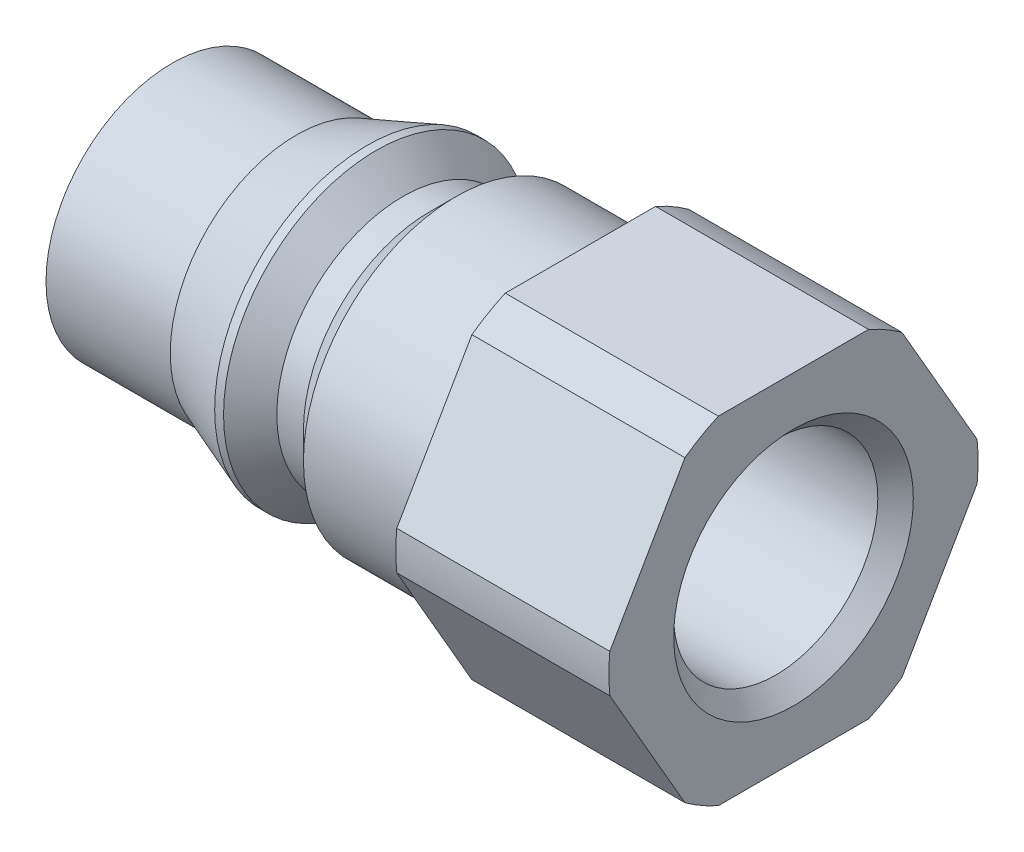
ISO-10303-21;
HEADER;
FILE_DESCRIPTION(('STEP AP214'),'2;1');
FILE_NAME('part.step','',(''),(''),'','','');
FILE_SCHEMA(('AUTOMOTIVE_DESIGN { 1 0 10303 214 1 1 1 1 }'));
ENDSEC;
DATA;
#1=APPLICATION_CONTEXT('core data for automotive mechanical design processes');
#2=APPLICATION_PROTOCOL_DEFINITION('international standard','automotive_design',2000,#1);
#3=PRODUCT_CONTEXT('',#1,'mechanical');
#4=PRODUCT('Part','Part','',(#3));
#5=PRODUCT_RELATED_PRODUCT_CATEGORY('part','',(#4));
#6=PRODUCT_DEFINITION_FORMATION('','',#4);
#7=PRODUCT_DEFINITION_CONTEXT('part definition',#1,'design');
#8=PRODUCT_DEFINITION('design','',#6,#7);
#9=PRODUCT_DEFINITION_SHAPE('','',#8);
#10=(LENGTH_UNIT() NAMED_UNIT(*) SI_UNIT(.MILLI.,.METRE.));
#11=(NAMED_UNIT(*) PLANE_ANGLE_UNIT() SI_UNIT($,.RADIAN.));
#12=(NAMED_UNIT(*) SI_UNIT($,.STERADIAN.) SOLID_ANGLE_UNIT());
#13=UNCERTAINTY_MEASURE_WITH_UNIT(LENGTH_MEASURE(1.E-05),#10,'distance_accuracy_value','');
#14=(GEOMETRIC_REPRESENTATION_CONTEXT(3) GLOBAL_UNCERTAINTY_ASSIGNED_CONTEXT((#13)) GLOBAL_UNIT_ASSIGNED_CONTEXT((#10,
#11,#12)) REPRESENTATION_CONTEXT('',''));
#15=CARTESIAN_POINT('',(0.,0.,0.));
#16=DIRECTION('',(0.,0.,1.));
#17=DIRECTION('',(1.,0.,0.));
#18=AXIS2_PLACEMENT_3D('',#15,#16,#17);
#19=CARTESIAN_POINT('',(0.,0.,0.));
#20=DIRECTION('',(-1.,0.,0.));
#21=DIRECTION('',(0.,0.,1.));
#22=AXIS2_PLACEMENT_3D('',#19,#20,#21);
#23=CYLINDRICAL_SURFACE('',#22,3.175);
#24=CARTESIAN_POINT('',(0.,0.,0.));
#25=DIRECTION('',(-1.,0.,0.));
#26=DIRECTION('',(0.,0.,1.));
#27=AXIS2_PLACEMENT_3D('',#24,#25,#26);
#28=CIRCLE('',#27,3.175);
#29=CARTESIAN_POINT('',(0.,0.,3.175));
#30=VERTEX_POINT('',#29);
#31=EDGE_CURVE('E166',#30,#30,#28,.T.);
#32=ORIENTED_EDGE('',*,*,#31,.T.);
#33=EDGE_LOOP('',(#32));
#34=FACE_BOUND('',#33,.T.);
#35=CARTESIAN_POINT('',(25.,0.,0.));
#36=DIRECTION('',(1.,0.,0.));
#37=DIRECTION('',(0.,0.,-1.));
#38=AXIS2_PLACEMENT_3D('',#35,#36,#37);
#39=CIRCLE('',#38,3.175);
#40=CARTESIAN_POINT('',(25.,0.,-3.175));
#41=VERTEX_POINT('',#40);
#42=EDGE_CURVE('E196',#41,#41,#39,.T.);
#43=ORIENTED_EDGE('',*,*,#42,.T.);
#44=EDGE_LOOP('',(#43));
#45=FACE_BOUND('',#44,.T.);
#46=ADVANCED_FACE('F40',(#34,#45),#23,.F.);
#47=CARTESIAN_POINT('',(23.,-8.6,0.));
#48=DIRECTION('',(-1.,0.,0.));
#49=DIRECTION('',(0.,0.,1.));
#50=AXIS2_PLACEMENT_3D('',#47,#48,#49);
#51=PLANE('',#50);
#52=CARTESIAN_POINT('',(23.,0.,0.));
#53=DIRECTION('',(-1.,0.,0.));
#54=DIRECTION('',(0.,0.,1.));
#55=AXIS2_PLACEMENT_3D('',#52,#53,#54);
#56=CIRCLE('',#55,8.6);
#57=CARTESIAN_POINT('',(23.,0.,8.6));
#58=VERTEX_POINT('',#57);
#59=EDGE_CURVE('E172',#58,#58,#56,.T.);
#60=ORIENTED_EDGE('',*,*,#59,.F.);
#61=EDGE_LOOP('',(#60));
#62=FACE_BOUND('',#61,.T.);
#63=CARTESIAN_POINT('',(23.,0.,0.));
#64=DIRECTION('',(-1.,0.,0.));
#65=DIRECTION('',(0.,0.,1.));
#66=AXIS2_PLACEMENT_3D('',#63,#64,#65);
#67=CIRCLE('',#66,10.4);
#68=CARTESIAN_POINT('',(23.,8.41503751686119,6.11123093900228));
#69=VERTEX_POINT('',#68);
#70=CARTESIAN_POINT('',(23.,9.5,4.23202079389976));
#71=VERTEX_POINT('',#70);
#72=EDGE_CURVE('E171',#69,#71,#67,.T.);
#73=ORIENTED_EDGE('',*,*,#72,.T.);
#74=DIRECTION('',(0.,0.,-1.));
#75=VECTOR('',#74,1.);
#76=CARTESIAN_POINT('',(23.,9.5,0.));
#77=LINE('',#76,#75);
#78=CARTESIAN_POINT('',(23.,9.5,-4.23202079389976));
#79=VERTEX_POINT('',#78);
#80=EDGE_CURVE('E272',#71,#79,#77,.T.);
#81=ORIENTED_EDGE('',*,*,#80,.T.);
#82=CARTESIAN_POINT('',(23.,8.41503751686118,-6.11123093900229));
#83=VERTEX_POINT('',#82);
#84=EDGE_CURVE('E149',#79,#83,#67,.T.);
#85=ORIENTED_EDGE('',*,*,#84,.T.);
#86=DIRECTION('',(0.,-0.866025403784439,-0.5));
#87=VECTOR('',#86,1.);
#88=CARTESIAN_POINT('',(23.,-1.7,-11.9511505722253));
#89=LINE('',#88,#87);
#90=CARTESIAN_POINT('',(23.,1.08496248313882,-10.343251732902));
#91=VERTEX_POINT('',#90);
#92=EDGE_CURVE('E282',#83,#91,#89,.T.);
#93=ORIENTED_EDGE('',*,*,#92,.T.);
#94=CARTESIAN_POINT('',(23.,-1.08496248313881,-10.343251732902));
#95=VERTEX_POINT('',#94);
#96=EDGE_CURVE('E357',#91,#95,#67,.T.);
#97=ORIENTED_EDGE('',*,*,#96,.T.);
#98=DIRECTION('',(0.,-0.866025403784438,0.5));
#99=VECTOR('',#98,1.);
#100=CARTESIAN_POINT('',(23.,-11.2,-4.50333209967907));
#101=LINE('',#100,#99);
#102=CARTESIAN_POINT('',(23.,-8.41503751686119,-6.11123093900227));
#103=VERTEX_POINT('',#102);
#104=EDGE_CURVE('E285',#95,#103,#101,.T.);
#105=ORIENTED_EDGE('',*,*,#104,.T.);
#106=CARTESIAN_POINT('',(23.,-9.5,-4.23202079389977));
#107=VERTEX_POINT('',#106);
#108=EDGE_CURVE('E358',#103,#107,#67,.T.);
#109=ORIENTED_EDGE('',*,*,#108,.T.);
#110=DIRECTION('',(0.,0.,1.));
#111=VECTOR('',#110,1.);
#112=CARTESIAN_POINT('',(23.,-9.5,0.));
#113=LINE('',#112,#111);
#114=CARTESIAN_POINT('',(23.,-9.49999999999999,4.23202079389978));
#115=VERTEX_POINT('',#114);
#116=EDGE_CURVE('E288',#107,#115,#113,.T.);
#117=ORIENTED_EDGE('',*,*,#116,.T.);
#118=CARTESIAN_POINT('',(23.,-8.41503751686118,6.11123093900229));
#119=VERTEX_POINT('',#118);
#120=EDGE_CURVE('E170',#115,#119,#67,.T.);
#121=ORIENTED_EDGE('',*,*,#120,.T.);
#122=DIRECTION('',(0.,0.866025403784439,0.5));
#123=VECTOR('',#122,1.);
#124=CARTESIAN_POINT('',(23.,-11.2,4.50333209967908));
#125=LINE('',#124,#123);
#126=CARTESIAN_POINT('',(23.,-1.08496248313881,10.3432517329021));
#127=VERTEX_POINT('',#126);
#128=EDGE_CURVE('E277',#119,#127,#125,.T.);
#129=ORIENTED_EDGE('',*,*,#128,.T.);
#130=CARTESIAN_POINT('',(23.,1.08496248313881,10.3432517329021));
#131=VERTEX_POINT('',#130);
#132=EDGE_CURVE('E158',#127,#131,#67,.T.);
#133=ORIENTED_EDGE('',*,*,#132,.T.);
#134=DIRECTION('',(0.,0.866025403784439,-0.5));
#135=VECTOR('',#134,1.);
#136=CARTESIAN_POINT('',(23.,-1.7,11.9511505722253));
#137=LINE('',#136,#135);
#138=EDGE_CURVE('E273',#131,#69,#137,.T.);
#139=ORIENTED_EDGE('',*,*,#138,.T.);
#140=EDGE_LOOP('',(#73,#81,#85,#93,#97,#105,#109,#117,#121,#129,#133,#139));
#141=FACE_BOUND('',#140,.T.);
#142=ADVANCED_FACE('F216',(#62,#141),#51,.T.);
#143=CARTESIAN_POINT('',(0.,0.,0.));
#144=DIRECTION('',(-1.,0.,0.));
#145=DIRECTION('',(0.,0.,1.));
#146=AXIS2_PLACEMENT_3D('',#143,#144,#145);
#147=CYLINDRICAL_SURFACE('',#146,10.4);
#148=ORIENTED_EDGE('',*,*,#84,.F.);
#149=DIRECTION('',(1.,0.,0.));
#150=VECTOR('',#149,1.);
#151=CARTESIAN_POINT('',(0.,9.5,-4.23202079389976));
#152=LINE('',#151,#150);
#153=CARTESIAN_POINT('',(35.,9.5,-4.23202079389976));
#154=VERTEX_POINT('',#153);
#155=EDGE_CURVE('E132',#79,#154,#152,.T.);
#156=ORIENTED_EDGE('',*,*,#155,.T.);
#157=CARTESIAN_POINT('',(35.,0.,0.));
#158=DIRECTION('',(-1.,0.,0.));
#159=DIRECTION('',(0.,0.,1.));
#160=AXIS2_PLACEMENT_3D('',#157,#158,#159);
#161=CIRCLE('',#160,10.4);
#162=CARTESIAN_POINT('',(35.,8.41503751686118,-6.11123093900229));
#163=VERTEX_POINT('',#162);
#164=EDGE_CURVE('E147',#154,#163,#161,.T.);
#165=ORIENTED_EDGE('',*,*,#164,.T.);
#166=DIRECTION('',(1.,0.,0.));
#167=VECTOR('',#166,1.);
#168=CARTESIAN_POINT('',(0.,8.41503751686118,-6.11123093900229));
#169=LINE('',#168,#167);
#170=EDGE_CURVE('E307',#83,#163,#169,.T.);
#171=ORIENTED_EDGE('',*,*,#170,.F.);
#172=EDGE_LOOP('',(#148,#156,#165,#171));
#173=FACE_BOUND('',#172,.T.);
#174=ADVANCED_FACE('F145',(#173),#147,.T.);
#175=CARTESIAN_POINT('',(35.,8.41503751686119,6.11123093900228));
#176=VERTEX_POINT('',#175);
#177=CARTESIAN_POINT('',(35.,9.5,4.23202079389976));
#178=VERTEX_POINT('',#177);
#179=EDGE_CURVE('E155',#176,#178,#161,.T.);
#180=ORIENTED_EDGE('',*,*,#179,.T.);
#181=DIRECTION('',(1.,0.,0.));
#182=VECTOR('',#181,1.);
#183=CARTESIAN_POINT('',(0.,9.5,4.23202079389976));
#184=LINE('',#183,#182);
#185=EDGE_CURVE('E135',#71,#178,#184,.T.);
#186=ORIENTED_EDGE('',*,*,#185,.F.);
#187=ORIENTED_EDGE('',*,*,#72,.F.);
#188=DIRECTION('',(1.,0.,0.));
#189=VECTOR('',#188,1.);
#190=CARTESIAN_POINT('',(0.,8.41503751686119,6.11123093900228));
#191=LINE('',#190,#189);
#192=EDGE_CURVE('E317',#69,#176,#191,.T.);
#193=ORIENTED_EDGE('',*,*,#192,.T.);
#194=EDGE_LOOP('',(#180,#186,#187,#193));
#195=FACE_BOUND('',#194,.T.);
#196=ADVANCED_FACE('F236',(#195),#147,.T.);
#197=CARTESIAN_POINT('',(35.,-1.08496248313881,10.3432517329021));
#198=VERTEX_POINT('',#197);
#199=CARTESIAN_POINT('',(35.,1.08496248313881,10.343251732902));
#200=VERTEX_POINT('',#199);
#201=EDGE_CURVE('E159',#198,#200,#161,.T.);
#202=ORIENTED_EDGE('',*,*,#201,.T.);
#203=DIRECTION('',(1.,0.,0.));
#204=VECTOR('',#203,1.);
#205=CARTESIAN_POINT('',(0.,1.08496248313881,10.3432517329021));
#206=LINE('',#205,#204);
#207=EDGE_CURVE('E140',#131,#200,#206,.T.);
#208=ORIENTED_EDGE('',*,*,#207,.F.);
#209=ORIENTED_EDGE('',*,*,#132,.F.);
#210=DIRECTION('',(1.,0.,0.));
#211=VECTOR('',#210,1.);
#212=CARTESIAN_POINT('',(0.,-1.08496248313881,10.3432517329021));
#213=LINE('',#212,#211);
#214=EDGE_CURVE('E311',#127,#198,#213,.T.);
#215=ORIENTED_EDGE('',*,*,#214,.T.);
#216=EDGE_LOOP('',(#202,#208,#209,#215));
#217=FACE_BOUND('',#216,.T.);
#218=ADVANCED_FACE('F376',(#217),#147,.T.);
#219=CARTESIAN_POINT('',(35.,-9.49999999999999,4.23202079389978));
#220=VERTEX_POINT('',#219);
#221=CARTESIAN_POINT('',(35.,-8.41503751686118,6.11123093900229));
#222=VERTEX_POINT('',#221);
#223=EDGE_CURVE('E165',#220,#222,#161,.T.);
#224=ORIENTED_EDGE('',*,*,#223,.T.);
#225=DIRECTION('',(1.,0.,0.));
#226=VECTOR('',#225,1.);
#227=CARTESIAN_POINT('',(0.,-8.41503751686118,6.11123093900229));
#228=LINE('',#227,#226);
#229=EDGE_CURVE('E56',#119,#222,#228,.T.);
#230=ORIENTED_EDGE('',*,*,#229,.F.);
#231=ORIENTED_EDGE('',*,*,#120,.F.);
#232=DIRECTION('',(1.,0.,0.));
#233=VECTOR('',#232,1.);
#234=CARTESIAN_POINT('',(0.,-9.49999999999999,4.23202079389978));
#235=LINE('',#234,#233);
#236=EDGE_CURVE('E291',#115,#220,#235,.T.);
#237=ORIENTED_EDGE('',*,*,#236,.T.);
#238=EDGE_LOOP('',(#224,#230,#231,#237));
#239=FACE_BOUND('',#238,.T.);
#240=ADVANCED_FACE('F366',(#239),#147,.T.);
#241=ORIENTED_EDGE('',*,*,#96,.F.);
#242=DIRECTION('',(1.,0.,0.));
#243=VECTOR('',#242,1.);
#244=CARTESIAN_POINT('',(0.,1.08496248313882,-10.343251732902));
#245=LINE('',#244,#243);
#246=CARTESIAN_POINT('',(35.,1.08496248313882,-10.343251732902));
#247=VERTEX_POINT('',#246);
#248=EDGE_CURVE('E304',#91,#247,#245,.T.);
#249=ORIENTED_EDGE('',*,*,#248,.T.);
#250=CARTESIAN_POINT('',(35.,-1.08496248313881,-10.343251732902));
#251=VERTEX_POINT('',#250);
#252=EDGE_CURVE('E156',#247,#251,#161,.T.);
#253=ORIENTED_EDGE('',*,*,#252,.T.);
#254=DIRECTION('',(1.,0.,0.));
#255=VECTOR('',#254,1.);
#256=CARTESIAN_POINT('',(0.,-1.08496248313881,-10.343251732902));
#257=LINE('',#256,#255);
#258=EDGE_CURVE('E300',#95,#251,#257,.T.);
#259=ORIENTED_EDGE('',*,*,#258,.F.);
#260=EDGE_LOOP('',(#241,#249,#253,#259));
#261=FACE_BOUND('',#260,.T.);
#262=ADVANCED_FACE('F356',(#261),#147,.T.);
#263=ORIENTED_EDGE('',*,*,#108,.F.);
#264=DIRECTION('',(1.,0.,0.));
#265=VECTOR('',#264,1.);
#266=CARTESIAN_POINT('',(0.,-8.41503751686119,-6.11123093900227));
#267=LINE('',#266,#265);
#268=CARTESIAN_POINT('',(35.,-8.41503751686119,-6.11123093900227));
#269=VERTEX_POINT('',#268);
#270=EDGE_CURVE('E297',#103,#269,#267,.T.);
#271=ORIENTED_EDGE('',*,*,#270,.T.);
#272=CARTESIAN_POINT('',(35.,-9.5,-4.23202079389977));
#273=VERTEX_POINT('',#272);
#274=EDGE_CURVE('E161',#269,#273,#161,.T.);
#275=ORIENTED_EDGE('',*,*,#274,.T.);
#276=DIRECTION('',(1.,0.,0.));
#277=VECTOR('',#276,1.);
#278=CARTESIAN_POINT('',(0.,-9.5,-4.23202079389977));
#279=LINE('',#278,#277);
#280=EDGE_CURVE('E64',#107,#273,#279,.T.);
#281=ORIENTED_EDGE('',*,*,#280,.F.);
#282=EDGE_LOOP('',(#263,#271,#275,#281));
#283=FACE_BOUND('',#282,.T.);
#284=ADVANCED_FACE('F233',(#283),#147,.T.);
#285=CARTESIAN_POINT('',(35.,-10.4,0.));
#286=DIRECTION('',(1.,0.,0.));
#287=DIRECTION('',(0.,0.,-1.));
#288=AXIS2_PLACEMENT_3D('',#285,#286,#287);
#289=PLANE('',#288);
#290=CARTESIAN_POINT('',(35.,0.,0.));
#291=DIRECTION('',(1.,0.,0.));
#292=DIRECTION('',(0.,0.,-1.));
#293=AXIS2_PLACEMENT_3D('',#290,#291,#292);
#294=CIRCLE('',#293,6.75000000000001);
#295=CARTESIAN_POINT('',(35.,0.,-6.75000000000001));
#296=VERTEX_POINT('',#295);
#297=EDGE_CURVE('E11',#296,#296,#294,.F.);
#298=ORIENTED_EDGE('',*,*,#297,.T.);
#299=EDGE_LOOP('',(#298));
#300=FACE_BOUND('',#299,.T.);
#301=ORIENTED_EDGE('',*,*,#164,.F.);
#302=DIRECTION('',(0.,0.,1.));
#303=VECTOR('',#302,1.);
#304=CARTESIAN_POINT('',(35.,9.5,0.));
#305=LINE('',#304,#303);
#306=EDGE_CURVE('E129',#154,#178,#305,.T.);
#307=ORIENTED_EDGE('',*,*,#306,.T.);
#308=ORIENTED_EDGE('',*,*,#179,.F.);
#309=DIRECTION('',(0.,-0.866025403784439,0.5));
#310=VECTOR('',#309,1.);
#311=CARTESIAN_POINT('',(35.,4.75,8.22724133595217));
#312=LINE('',#311,#310);
#313=EDGE_CURVE('E315',#176,#200,#312,.T.);
#314=ORIENTED_EDGE('',*,*,#313,.T.);
#315=ORIENTED_EDGE('',*,*,#201,.F.);
#316=DIRECTION('',(0.,-0.866025403784439,-0.5));
#317=VECTOR('',#316,1.);
#318=CARTESIAN_POINT('',(35.,-4.75,8.22724133595217));
#319=LINE('',#318,#317);
#320=EDGE_CURVE('E309',#198,#222,#319,.T.);
#321=ORIENTED_EDGE('',*,*,#320,.T.);
#322=ORIENTED_EDGE('',*,*,#223,.F.);
#323=DIRECTION('',(0.,0.,-1.));
#324=VECTOR('',#323,1.);
#325=CARTESIAN_POINT('',(35.,-9.5,0.));
#326=LINE('',#325,#324);
#327=EDGE_CURVE('E198',#220,#273,#326,.T.);
#328=ORIENTED_EDGE('',*,*,#327,.T.);
#329=ORIENTED_EDGE('',*,*,#274,.F.);
#330=DIRECTION('',(0.,0.866025403784438,-0.5));
#331=VECTOR('',#330,1.);
#332=CARTESIAN_POINT('',(35.,-4.75,-8.22724133595216));
#333=LINE('',#332,#331);
#334=EDGE_CURVE('E295',#269,#251,#333,.T.);
#335=ORIENTED_EDGE('',*,*,#334,.T.);
#336=ORIENTED_EDGE('',*,*,#252,.F.);
#337=DIRECTION('',(0.,0.866025403784439,0.5));
#338=VECTOR('',#337,1.);
#339=CARTESIAN_POINT('',(35.,4.75,-8.22724133595217));
#340=LINE('',#339,#338);
#341=EDGE_CURVE('E154',#247,#163,#340,.T.);
#342=ORIENTED_EDGE('',*,*,#341,.T.);
#343=EDGE_LOOP('',(#301,#307,#308,#314,#315,#321,#322,#328,#329,#335,#336,#342));
#344=FACE_BOUND('',#343,.T.);
#345=ADVANCED_FACE('F152',(#300,#344),#289,.T.);
#346=CARTESIAN_POINT('',(0.,-3.175,0.));
#347=DIRECTION('',(-1.,0.,0.));
#348=DIRECTION('',(0.,0.,1.));
#349=AXIS2_PLACEMENT_3D('',#346,#347,#348);
#350=PLANE('',#349);
#351=CARTESIAN_POINT('',(0.,0.,0.));
#352=DIRECTION('',(-1.,0.,0.));
#353=DIRECTION('',(0.,0.,1.));
#354=AXIS2_PLACEMENT_3D('',#351,#352,#353);
#355=CIRCLE('',#354,7.1);
#356=CARTESIAN_POINT('',(0.,0.,7.1));
#357=VERTEX_POINT('',#356);
#358=EDGE_CURVE('E193',#357,#357,#355,.T.);
#359=ORIENTED_EDGE('',*,*,#358,.T.);
#360=EDGE_LOOP('',(#359));
#361=FACE_BOUND('',#360,.T.);
#362=ORIENTED_EDGE('',*,*,#31,.F.);
#363=EDGE_LOOP('',(#362));
#364=FACE_BOUND('',#363,.T.);
#365=ADVANCED_FACE('F232',(#361,#364),#350,.T.);
#366=CARTESIAN_POINT('',(0.,0.,0.));
#367=DIRECTION('',(-1.,0.,0.));
#368=DIRECTION('',(0.,0.,1.));
#369=AXIS2_PLACEMENT_3D('',#366,#367,#368);
#370=CYLINDRICAL_SURFACE('',#369,7.1);
#371=CARTESIAN_POINT('',(7.,0.,0.));
#372=DIRECTION('',(-1.,0.,0.));
#373=DIRECTION('',(0.,0.,1.));
#374=AXIS2_PLACEMENT_3D('',#371,#372,#373);
#375=CIRCLE('',#374,7.1);
#376=CARTESIAN_POINT('',(7.,0.,7.1));
#377=VERTEX_POINT('',#376);
#378=EDGE_CURVE('E190',#377,#377,#375,.T.);
#379=ORIENTED_EDGE('',*,*,#378,.T.);
#380=EDGE_LOOP('',(#379));
#381=FACE_BOUND('',#380,.T.);
#382=ORIENTED_EDGE('',*,*,#358,.F.);
#383=EDGE_LOOP('',(#382));
#384=FACE_BOUND('',#383,.T.);
#385=ADVANCED_FACE('F261',(#381,#384),#370,.T.);
#386=CARTESIAN_POINT('',(7.,0.,0.));
#387=DIRECTION('',(1.,0.,0.));
#388=DIRECTION('',(0.,0.,-1.));
#389=AXIS2_PLACEMENT_3D('',#386,#387,#388);
#390=CONICAL_SURFACE('',#389,7.1,0.358770670270572);
#391=CARTESIAN_POINT('',(11.,0.,0.));
#392=DIRECTION('',(-1.,0.,0.));
#393=DIRECTION('',(0.,0.,1.));
#394=AXIS2_PLACEMENT_3D('',#391,#392,#393);
#395=CIRCLE('',#394,8.6);
#396=CARTESIAN_POINT('',(11.,0.,8.6));
#397=VERTEX_POINT('',#396);
#398=EDGE_CURVE('E187',#397,#397,#395,.T.);
#399=ORIENTED_EDGE('',*,*,#398,.T.);
#400=EDGE_LOOP('',(#399));
#401=FACE_BOUND('',#400,.T.);
#402=ORIENTED_EDGE('',*,*,#378,.F.);
#403=EDGE_LOOP('',(#402));
#404=FACE_BOUND('',#403,.T.);
#405=ADVANCED_FACE('F257',(#401,#404),#390,.T.);
#406=CARTESIAN_POINT('',(0.,0.,0.));
#407=DIRECTION('',(-1.,0.,0.));
#408=DIRECTION('',(0.,0.,1.));
#409=AXIS2_PLACEMENT_3D('',#406,#407,#408);
#410=CYLINDRICAL_SURFACE('',#409,8.6);
#411=CARTESIAN_POINT('',(11.5,0.,0.));
#412=DIRECTION('',(-1.,0.,0.));
#413=DIRECTION('',(0.,0.,1.));
#414=AXIS2_PLACEMENT_3D('',#411,#412,#413);
#415=CIRCLE('',#414,8.6);
#416=CARTESIAN_POINT('',(11.5,0.,8.6));
#417=VERTEX_POINT('',#416);
#418=EDGE_CURVE('E184',#417,#417,#415,.T.);
#419=ORIENTED_EDGE('',*,*,#418,.T.);
#420=EDGE_LOOP('',(#419));
#421=FACE_BOUND('',#420,.T.);
#422=ORIENTED_EDGE('',*,*,#398,.F.);
#423=EDGE_LOOP('',(#422));
#424=FACE_BOUND('',#423,.T.);
#425=ADVANCED_FACE('F253',(#421,#424),#410,.T.);
#426=CARTESIAN_POINT('',(11.5,0.,0.));
#427=DIRECTION('',(-1.,0.,0.));
#428=DIRECTION('',(0.,0.,1.));
#429=AXIS2_PLACEMENT_3D('',#426,#427,#428);
#430=CONICAL_SURFACE('',#429,8.6,0.785398163397451);
#431=CARTESIAN_POINT('',(13.,0.,0.));
#432=DIRECTION('',(-1.,0.,0.));
#433=DIRECTION('',(0.,0.,1.));
#434=AXIS2_PLACEMENT_3D('',#431,#432,#433);
#435=CIRCLE('',#434,7.1);
#436=CARTESIAN_POINT('',(13.,0.,7.1));
#437=VERTEX_POINT('',#436);
#438=EDGE_CURVE('E181',#437,#437,#435,.T.);
#439=ORIENTED_EDGE('',*,*,#438,.T.);
#440=EDGE_LOOP('',(#439));
#441=FACE_BOUND('',#440,.T.);
#442=ORIENTED_EDGE('',*,*,#418,.F.);
#443=EDGE_LOOP('',(#442));
#444=FACE_BOUND('',#443,.T.);
#445=ADVANCED_FACE('F249',(#441,#444),#430,.T.);
#446=CARTESIAN_POINT('',(0.,0.,0.));
#447=DIRECTION('',(-1.,0.,0.));
#448=DIRECTION('',(0.,0.,1.));
#449=AXIS2_PLACEMENT_3D('',#446,#447,#448);
#450=CYLINDRICAL_SURFACE('',#449,7.1);
#451=CARTESIAN_POINT('',(14.5,0.,0.));
#452=DIRECTION('',(-1.,0.,0.));
#453=DIRECTION('',(0.,0.,1.));
#454=AXIS2_PLACEMENT_3D('',#451,#452,#453);
#455=CIRCLE('',#454,7.1);
#456=CARTESIAN_POINT('',(14.5,0.,7.1));
#457=VERTEX_POINT('',#456);
#458=EDGE_CURVE('E178',#457,#457,#455,.T.);
#459=ORIENTED_EDGE('',*,*,#458,.T.);
#460=EDGE_LOOP('',(#459));
#461=FACE_BOUND('',#460,.T.);
#462=ORIENTED_EDGE('',*,*,#438,.F.);
#463=EDGE_LOOP('',(#462));
#464=FACE_BOUND('',#463,.T.);
#465=ADVANCED_FACE('F245',(#461,#464),#450,.T.);
#466=CARTESIAN_POINT('',(14.5,0.,0.));
#467=DIRECTION('',(1.,0.,0.));
#468=DIRECTION('',(0.,0.,-1.));
#469=AXIS2_PLACEMENT_3D('',#466,#467,#468);
#470=CONICAL_SURFACE('',#469,7.1,0.78539816339745);
#471=CARTESIAN_POINT('',(16.,0.,0.));
#472=DIRECTION('',(-1.,0.,0.));
#473=DIRECTION('',(0.,0.,1.));
#474=AXIS2_PLACEMENT_3D('',#471,#472,#473);
#475=CIRCLE('',#474,8.6);
#476=CARTESIAN_POINT('',(16.,0.,8.6));
#477=VERTEX_POINT('',#476);
#478=EDGE_CURVE('E175',#477,#477,#475,.T.);
#479=ORIENTED_EDGE('',*,*,#478,.T.);
#480=EDGE_LOOP('',(#479));
#481=FACE_BOUND('',#480,.T.);
#482=ORIENTED_EDGE('',*,*,#458,.F.);
#483=EDGE_LOOP('',(#482));
#484=FACE_BOUND('',#483,.T.);
#485=ADVANCED_FACE('F241',(#481,#484),#470,.T.);
#486=CARTESIAN_POINT('',(0.,0.,0.));
#487=DIRECTION('',(-1.,0.,0.));
#488=DIRECTION('',(0.,0.,1.));
#489=AXIS2_PLACEMENT_3D('',#486,#487,#488);
#490=CYLINDRICAL_SURFACE('',#489,8.6);
#491=ORIENTED_EDGE('',*,*,#59,.T.);
#492=EDGE_LOOP('',(#491));
#493=FACE_BOUND('',#492,.T.);
#494=ORIENTED_EDGE('',*,*,#478,.F.);
#495=EDGE_LOOP('',(#494));
#496=FACE_BOUND('',#495,.T.);
#497=ADVANCED_FACE('F238',(#493,#496),#490,.T.);
#498=CARTESIAN_POINT('',(0.,-9.5,0.));
#499=DIRECTION('',(0.,-1.,0.));
#500=DIRECTION('',(0.,0.,-1.));
#501=AXIS2_PLACEMENT_3D('',#498,#499,#500);
#502=PLANE('',#501);
#503=ORIENTED_EDGE('',*,*,#280,.T.);
#504=ORIENTED_EDGE('',*,*,#327,.F.);
#505=ORIENTED_EDGE('',*,*,#236,.F.);
#506=ORIENTED_EDGE('',*,*,#116,.F.);
#507=EDGE_LOOP('',(#503,#504,#505,#506));
#508=FACE_BOUND('',#507,.T.);
#509=ADVANCED_FACE('F228',(#508),#502,.T.);
#510=CARTESIAN_POINT('',(0.,-4.75,-8.22724133595216));
#511=DIRECTION('',(0.,-0.5,-0.866025403784438));
#512=DIRECTION('',(0.,0.866025403784438,-0.5));
#513=AXIS2_PLACEMENT_3D('',#510,#511,#512);
#514=PLANE('',#513);
#515=ORIENTED_EDGE('',*,*,#258,.T.);
#516=ORIENTED_EDGE('',*,*,#334,.F.);
#517=ORIENTED_EDGE('',*,*,#270,.F.);
#518=ORIENTED_EDGE('',*,*,#104,.F.);
#519=EDGE_LOOP('',(#515,#516,#517,#518));
#520=FACE_BOUND('',#519,.T.);
#521=ADVANCED_FACE('F343',(#520),#514,.T.);
#522=CARTESIAN_POINT('',(0.,4.75,-8.22724133595217));
#523=DIRECTION('',(0.,0.5,-0.866025403784439));
#524=DIRECTION('',(0.,0.866025403784439,0.5));
#525=AXIS2_PLACEMENT_3D('',#522,#523,#524);
#526=PLANE('',#525);
#527=ORIENTED_EDGE('',*,*,#170,.T.);
#528=ORIENTED_EDGE('',*,*,#341,.F.);
#529=ORIENTED_EDGE('',*,*,#248,.F.);
#530=ORIENTED_EDGE('',*,*,#92,.F.);
#531=EDGE_LOOP('',(#527,#528,#529,#530));
#532=FACE_BOUND('',#531,.T.);
#533=ADVANCED_FACE('F341',(#532),#526,.T.);
#534=CARTESIAN_POINT('',(0.,-4.75,8.22724133595217));
#535=DIRECTION('',(0.,-0.5,0.866025403784439));
#536=DIRECTION('',(0.,-0.866025403784439,-0.5));
#537=AXIS2_PLACEMENT_3D('',#534,#535,#536);
#538=PLANE('',#537);
#539=ORIENTED_EDGE('',*,*,#229,.T.);
#540=ORIENTED_EDGE('',*,*,#320,.F.);
#541=ORIENTED_EDGE('',*,*,#214,.F.);
#542=ORIENTED_EDGE('',*,*,#128,.F.);
#543=EDGE_LOOP('',(#539,#540,#541,#542));
#544=FACE_BOUND('',#543,.T.);
#545=ADVANCED_FACE('F337',(#544),#538,.T.);
#546=CARTESIAN_POINT('',(0.,4.75,8.22724133595217));
#547=DIRECTION('',(0.,0.5,0.866025403784439));
#548=DIRECTION('',(0.,-0.866025403784439,0.5));
#549=AXIS2_PLACEMENT_3D('',#546,#547,#548);
#550=PLANE('',#549);
#551=ORIENTED_EDGE('',*,*,#207,.T.);
#552=ORIENTED_EDGE('',*,*,#313,.F.);
#553=ORIENTED_EDGE('',*,*,#192,.F.);
#554=ORIENTED_EDGE('',*,*,#138,.F.);
#555=EDGE_LOOP('',(#551,#552,#553,#554));
#556=FACE_BOUND('',#555,.T.);
#557=ADVANCED_FACE('F332',(#556),#550,.T.);
#558=CARTESIAN_POINT('',(0.,9.5,0.));
#559=DIRECTION('',(0.,1.,0.));
#560=DIRECTION('',(0.,0.,1.));
#561=AXIS2_PLACEMENT_3D('',#558,#559,#560);
#562=PLANE('',#561);
#563=ORIENTED_EDGE('',*,*,#185,.T.);
#564=ORIENTED_EDGE('',*,*,#306,.F.);
#565=ORIENTED_EDGE('',*,*,#155,.F.);
#566=ORIENTED_EDGE('',*,*,#80,.F.);
#567=EDGE_LOOP('',(#563,#564,#565,#566));
#568=FACE_BOUND('',#567,.T.);
#569=ADVANCED_FACE('F131',(#568),#562,.T.);
#570=CARTESIAN_POINT('',(25.,0.,0.));
#571=DIRECTION('',(1.,0.,0.));
#572=DIRECTION('',(0.,0.,-1.));
#573=AXIS2_PLACEMENT_3D('',#570,#571,#572);
#574=CYLINDRICAL_SURFACE('',#573,5.75);
#575=CARTESIAN_POINT('',(34.,0.,0.));
#576=DIRECTION('',(1.,0.,0.));
#577=DIRECTION('',(0.,0.,-1.));
#578=AXIS2_PLACEMENT_3D('',#575,#576,#577);
#579=CIRCLE('',#578,5.75);
#580=CARTESIAN_POINT('',(34.,0.,-5.75));
#581=VERTEX_POINT('',#580);
#582=EDGE_CURVE('E49',#581,#581,#579,.T.);
#583=ORIENTED_EDGE('',*,*,#582,.T.);
#584=EDGE_LOOP('',(#583));
#585=FACE_BOUND('',#584,.T.);
#586=CARTESIAN_POINT('',(25.,0.,0.));
#587=DIRECTION('',(1.,0.,0.));
#588=DIRECTION('',(0.,0.,-1.));
#589=AXIS2_PLACEMENT_3D('',#586,#587,#588);
#590=CIRCLE('',#589,5.75);
#591=CARTESIAN_POINT('',(25.,0.,-5.75));
#592=VERTEX_POINT('',#591);
#593=EDGE_CURVE('E199',#592,#592,#590,.T.);
#594=ORIENTED_EDGE('',*,*,#593,.F.);
#595=EDGE_LOOP('',(#594));
#596=FACE_BOUND('',#595,.T.);
#597=ADVANCED_FACE('F203',(#585,#596),#574,.F.);
#598=CARTESIAN_POINT('',(25.,0.,0.));
#599=DIRECTION('',(1.,0.,0.));
#600=DIRECTION('',(0.,0.,-1.));
#601=AXIS2_PLACEMENT_3D('',#598,#599,#600);
#602=PLANE('',#601);
#603=ORIENTED_EDGE('',*,*,#42,.F.);
#604=EDGE_LOOP('',(#603));
#605=FACE_BOUND('',#604,.T.);
#606=ORIENTED_EDGE('',*,*,#593,.T.);
#607=EDGE_LOOP('',(#606));
#608=FACE_BOUND('',#607,.T.);
#609=ADVANCED_FACE('F207',(#605,#608),#602,.T.);
#610=CARTESIAN_POINT('',(34.,0.,0.));
#611=DIRECTION('',(1.,0.,0.));
#612=DIRECTION('',(0.,0.,-1.));
#613=AXIS2_PLACEMENT_3D('',#610,#611,#612);
#614=CONICAL_SURFACE('',#613,5.75,0.785398163397454);
#615=ORIENTED_EDGE('',*,*,#297,.F.);
#616=EDGE_LOOP('',(#615));
#617=FACE_BOUND('',#616,.T.);
#618=ORIENTED_EDGE('',*,*,#582,.F.);
#619=EDGE_LOOP('',(#618));
#620=FACE_BOUND('',#619,.T.);
#621=ADVANCED_FACE('F43',(#617,#620),#614,.F.);
#622=CLOSED_SHELL('',(#46,#142,#174,#196,#218,#240,#262,#284,#345,#365,#385,#405,#425,#445,#465,
#485,#497,#509,#521,#533,#545,#557,#569,#597,#609,#621));
#623=MANIFOLD_SOLID_BREP('B2',#622);
#624=ADVANCED_BREP_SHAPE_REPRESENTATION('',(#18,#623),#14);
#625=SHAPE_DEFINITION_REPRESENTATION(#9,#624);
ENDSEC;
END-ISO-10303-21;
